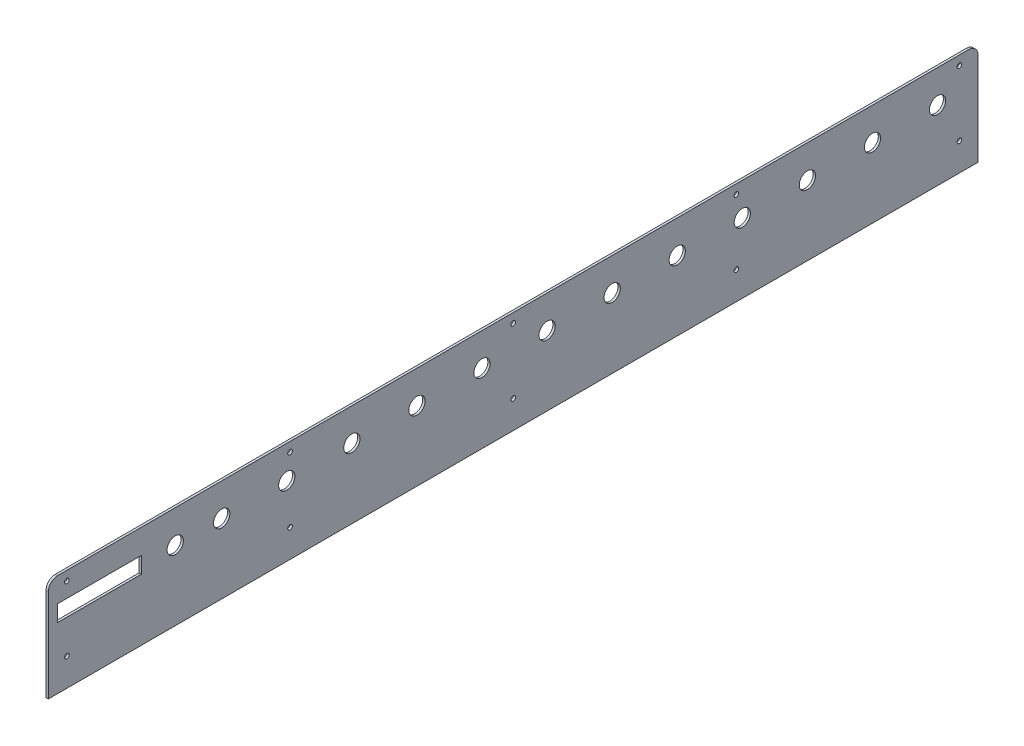
ISO-10303-21;
HEADER;
FILE_DESCRIPTION(('STEP AP214'),'2;1');
FILE_NAME('part.step','',(''),(''),'','','');
FILE_SCHEMA(('AUTOMOTIVE_DESIGN { 1 0 10303 214 1 1 1 1 }'));
ENDSEC;
DATA;
#1=APPLICATION_CONTEXT('core data for automotive mechanical design processes');
#2=APPLICATION_PROTOCOL_DEFINITION('international standard','automotive_design',2000,#1);
#3=PRODUCT_CONTEXT('',#1,'mechanical');
#4=PRODUCT('Part','Part','',(#3));
#5=PRODUCT_RELATED_PRODUCT_CATEGORY('part','',(#4));
#6=PRODUCT_DEFINITION_FORMATION('','',#4);
#7=PRODUCT_DEFINITION_CONTEXT('part definition',#1,'design');
#8=PRODUCT_DEFINITION('design','',#6,#7);
#9=PRODUCT_DEFINITION_SHAPE('','',#8);
#10=(LENGTH_UNIT() NAMED_UNIT(*) SI_UNIT(.MILLI.,.METRE.));
#11=(NAMED_UNIT(*) PLANE_ANGLE_UNIT() SI_UNIT($,.RADIAN.));
#12=(NAMED_UNIT(*) SI_UNIT($,.STERADIAN.) SOLID_ANGLE_UNIT());
#13=UNCERTAINTY_MEASURE_WITH_UNIT(LENGTH_MEASURE(1.E-05),#10,'distance_accuracy_value','');
#14=(GEOMETRIC_REPRESENTATION_CONTEXT(3) GLOBAL_UNCERTAINTY_ASSIGNED_CONTEXT((#13)) GLOBAL_UNIT_ASSIGNED_CONTEXT((#10,
#11,#12)) REPRESENTATION_CONTEXT('',''));
#15=CARTESIAN_POINT('',(0.,0.,0.));
#16=DIRECTION('',(0.,0.,1.));
#17=DIRECTION('',(1.,0.,0.));
#18=AXIS2_PLACEMENT_3D('',#15,#16,#17);
#19=CARTESIAN_POINT('',(0.,0.,0.));
#20=DIRECTION('',(0.,-1.,0.));
#21=DIRECTION('',(0.,0.,-1.));
#22=AXIS2_PLACEMENT_3D('',#19,#20,#21);
#23=PLANE('',#22);
#24=DIRECTION('',(0.,0.,-1.));
#25=VECTOR('',#24,1.);
#26=CARTESIAN_POINT('',(2.5,0.,0.));
#27=LINE('',#26,#25);
#28=CARTESIAN_POINT('',(2.5,0.,0.));
#29=VERTEX_POINT('',#28);
#30=CARTESIAN_POINT('',(2.5,0.,-1000.));
#31=VERTEX_POINT('',#30);
#32=EDGE_CURVE('E232',#29,#31,#27,.T.);
#33=ORIENTED_EDGE('',*,*,#32,.F.);
#34=DIRECTION('',(1.,0.,0.));
#35=VECTOR('',#34,1.);
#36=CARTESIAN_POINT('',(0.,0.,0.));
#37=LINE('',#36,#35);
#38=CARTESIAN_POINT('',(0.,0.,0.));
#39=VERTEX_POINT('',#38);
#40=EDGE_CURVE('E11',#39,#29,#37,.T.);
#41=ORIENTED_EDGE('',*,*,#40,.F.);
#42=DIRECTION('',(0.,0.,-1.));
#43=VECTOR('',#42,1.);
#44=CARTESIAN_POINT('',(0.,0.,0.));
#45=LINE('',#44,#43);
#46=CARTESIAN_POINT('',(0.,0.,-1000.));
#47=VERTEX_POINT('',#46);
#48=EDGE_CURVE('E235',#39,#47,#45,.T.);
#49=ORIENTED_EDGE('',*,*,#48,.T.);
#50=DIRECTION('',(1.,0.,0.));
#51=VECTOR('',#50,1.);
#52=CARTESIAN_POINT('',(0.,0.,-1000.));
#53=LINE('',#52,#51);
#54=EDGE_CURVE('E42',#47,#31,#53,.T.);
#55=ORIENTED_EDGE('',*,*,#54,.T.);
#56=EDGE_LOOP('',(#33,#41,#49,#55));
#57=FACE_BOUND('',#56,.T.);
#58=ADVANCED_FACE('F39',(#57),#23,.T.);
#59=CARTESIAN_POINT('',(0.,100.,0.));
#60=DIRECTION('',(0.,0.,1.));
#61=DIRECTION('',(1.,0.,0.));
#62=AXIS2_PLACEMENT_3D('',#59,#60,#61);
#63=PLANE('',#62);
#64=DIRECTION('',(0.,-1.,0.));
#65=VECTOR('',#64,1.);
#66=CARTESIAN_POINT('',(2.5,100.,0.));
#67=LINE('',#66,#65);
#68=CARTESIAN_POINT('',(2.5,100.,0.));
#69=VERTEX_POINT('',#68);
#70=EDGE_CURVE('E239',#69,#29,#67,.T.);
#71=ORIENTED_EDGE('',*,*,#70,.F.);
#72=DIRECTION('',(1.,0.,0.));
#73=VECTOR('',#72,1.);
#74=CARTESIAN_POINT('',(0.,100.,0.));
#75=LINE('',#74,#73);
#76=CARTESIAN_POINT('',(0.,100.,0.));
#77=VERTEX_POINT('',#76);
#78=EDGE_CURVE('E47',#77,#69,#75,.T.);
#79=ORIENTED_EDGE('',*,*,#78,.F.);
#80=DIRECTION('',(0.,-1.,0.));
#81=VECTOR('',#80,1.);
#82=CARTESIAN_POINT('',(0.,100.,0.));
#83=LINE('',#82,#81);
#84=EDGE_CURVE('E251',#77,#39,#83,.T.);
#85=ORIENTED_EDGE('',*,*,#84,.T.);
#86=ORIENTED_EDGE('',*,*,#40,.T.);
#87=EDGE_LOOP('',(#71,#79,#85,#86));
#88=FACE_BOUND('',#87,.T.);
#89=ADVANCED_FACE('F288',(#88),#63,.T.);
#90=CARTESIAN_POINT('',(0.,100.,-10.));
#91=DIRECTION('',(1.,0.,0.));
#92=DIRECTION('',(0.,0.,-1.));
#93=AXIS2_PLACEMENT_3D('',#90,#91,#92);
#94=CYLINDRICAL_SURFACE('',#93,10.);
#95=CARTESIAN_POINT('',(2.5,100.,-10.));
#96=DIRECTION('',(1.,0.,0.));
#97=DIRECTION('',(0.,0.,-1.));
#98=AXIS2_PLACEMENT_3D('',#95,#96,#97);
#99=CIRCLE('',#98,10.);
#100=CARTESIAN_POINT('',(2.5,110.,-10.));
#101=VERTEX_POINT('',#100);
#102=EDGE_CURVE('E265',#101,#69,#99,.T.);
#103=ORIENTED_EDGE('',*,*,#102,.F.);
#104=DIRECTION('',(1.,0.,0.));
#105=VECTOR('',#104,1.);
#106=CARTESIAN_POINT('',(0.,110.,-10.));
#107=LINE('',#106,#105);
#108=CARTESIAN_POINT('',(0.,110.,-10.));
#109=VERTEX_POINT('',#108);
#110=EDGE_CURVE('E271',#109,#101,#107,.T.);
#111=ORIENTED_EDGE('',*,*,#110,.F.);
#112=CARTESIAN_POINT('',(0.,100.,-10.));
#113=DIRECTION('',(1.,0.,0.));
#114=DIRECTION('',(0.,0.,-1.));
#115=AXIS2_PLACEMENT_3D('',#112,#113,#114);
#116=CIRCLE('',#115,10.);
#117=EDGE_CURVE('E248',#109,#77,#116,.T.);
#118=ORIENTED_EDGE('',*,*,#117,.T.);
#119=ORIENTED_EDGE('',*,*,#78,.T.);
#120=EDGE_LOOP('',(#103,#111,#118,#119));
#121=FACE_BOUND('',#120,.T.);
#122=ADVANCED_FACE('F300',(#121),#94,.T.);
#123=CARTESIAN_POINT('',(0.,110.,-990.));
#124=DIRECTION('',(0.,1.,0.));
#125=DIRECTION('',(0.,0.,1.));
#126=AXIS2_PLACEMENT_3D('',#123,#124,#125);
#127=PLANE('',#126);
#128=DIRECTION('',(0.,0.,1.));
#129=VECTOR('',#128,1.);
#130=CARTESIAN_POINT('',(2.5,110.,-990.));
#131=LINE('',#130,#129);
#132=CARTESIAN_POINT('',(2.5,110.,-990.));
#133=VERTEX_POINT('',#132);
#134=EDGE_CURVE('E262',#133,#101,#131,.T.);
#135=ORIENTED_EDGE('',*,*,#134,.F.);
#136=DIRECTION('',(1.,0.,0.));
#137=VECTOR('',#136,1.);
#138=CARTESIAN_POINT('',(0.,110.,-990.));
#139=LINE('',#138,#137);
#140=CARTESIAN_POINT('',(0.,110.,-990.));
#141=VERTEX_POINT('',#140);
#142=EDGE_CURVE('E273',#141,#133,#139,.T.);
#143=ORIENTED_EDGE('',*,*,#142,.F.);
#144=DIRECTION('',(0.,0.,1.));
#145=VECTOR('',#144,1.);
#146=CARTESIAN_POINT('',(0.,110.,-990.));
#147=LINE('',#146,#145);
#148=EDGE_CURVE('E245',#141,#109,#147,.T.);
#149=ORIENTED_EDGE('',*,*,#148,.T.);
#150=ORIENTED_EDGE('',*,*,#110,.T.);
#151=EDGE_LOOP('',(#135,#143,#149,#150));
#152=FACE_BOUND('',#151,.T.);
#153=ADVANCED_FACE('F298',(#152),#127,.T.);
#154=CARTESIAN_POINT('',(0.,100.,-990.));
#155=DIRECTION('',(1.,0.,0.));
#156=DIRECTION('',(0.,0.,-1.));
#157=AXIS2_PLACEMENT_3D('',#154,#155,#156);
#158=CYLINDRICAL_SURFACE('',#157,10.);
#159=CARTESIAN_POINT('',(2.5,100.,-990.));
#160=DIRECTION('',(1.,0.,0.));
#161=DIRECTION('',(0.,0.,-1.));
#162=AXIS2_PLACEMENT_3D('',#159,#160,#161);
#163=CIRCLE('',#162,10.);
#164=CARTESIAN_POINT('',(2.5,100.,-1000.));
#165=VERTEX_POINT('',#164);
#166=EDGE_CURVE('E259',#165,#133,#163,.T.);
#167=ORIENTED_EDGE('',*,*,#166,.F.);
#168=DIRECTION('',(1.,0.,0.));
#169=VECTOR('',#168,1.);
#170=CARTESIAN_POINT('',(0.,100.,-1000.));
#171=LINE('',#170,#169);
#172=CARTESIAN_POINT('',(0.,100.,-1000.));
#173=VERTEX_POINT('',#172);
#174=EDGE_CURVE('E274',#173,#165,#171,.T.);
#175=ORIENTED_EDGE('',*,*,#174,.F.);
#176=CARTESIAN_POINT('',(0.,100.,-990.));
#177=DIRECTION('',(1.,0.,0.));
#178=DIRECTION('',(0.,0.,-1.));
#179=AXIS2_PLACEMENT_3D('',#176,#177,#178);
#180=CIRCLE('',#179,10.);
#181=EDGE_CURVE('E242',#173,#141,#180,.T.);
#182=ORIENTED_EDGE('',*,*,#181,.T.);
#183=ORIENTED_EDGE('',*,*,#142,.T.);
#184=EDGE_LOOP('',(#167,#175,#182,#183));
#185=FACE_BOUND('',#184,.T.);
#186=ADVANCED_FACE('F295',(#185),#158,.T.);
#187=CARTESIAN_POINT('',(0.,0.,-1000.));
#188=DIRECTION('',(0.,0.,-1.));
#189=DIRECTION('',(-1.,0.,0.));
#190=AXIS2_PLACEMENT_3D('',#187,#188,#189);
#191=PLANE('',#190);
#192=DIRECTION('',(0.,1.,0.));
#193=VECTOR('',#192,1.);
#194=CARTESIAN_POINT('',(2.5,0.,-1000.));
#195=LINE('',#194,#193);
#196=EDGE_CURVE('E256',#31,#165,#195,.T.);
#197=ORIENTED_EDGE('',*,*,#196,.F.);
#198=ORIENTED_EDGE('',*,*,#54,.F.);
#199=DIRECTION('',(0.,1.,0.));
#200=VECTOR('',#199,1.);
#201=CARTESIAN_POINT('',(0.,0.,-1000.));
#202=LINE('',#201,#200);
#203=EDGE_CURVE('E238',#47,#173,#202,.T.);
#204=ORIENTED_EDGE('',*,*,#203,.T.);
#205=ORIENTED_EDGE('',*,*,#174,.T.);
#206=EDGE_LOOP('',(#197,#198,#204,#205));
#207=FACE_BOUND('',#206,.T.);
#208=ADVANCED_FACE('F282',(#207),#191,.T.);
#209=CARTESIAN_POINT('',(0.,100.,-990.));
#210=DIRECTION('',(1.,0.,0.));
#211=DIRECTION('',(0.,0.,-1.));
#212=AXIS2_PLACEMENT_3D('',#209,#210,#211);
#213=PLANE('',#212);
#214=CARTESIAN_POINT('',(0.,100.,-740.));
#215=DIRECTION('',(1.,0.,0.));
#216=DIRECTION('',(0.,0.,-1.));
#217=AXIS2_PLACEMENT_3D('',#214,#215,#216);
#218=CIRCLE('',#217,2.49999999999991);
#219=CARTESIAN_POINT('',(0.,100.,-742.5));
#220=VERTEX_POINT('',#219);
#221=EDGE_CURVE('E631',#220,#220,#218,.T.);
#222=ORIENTED_EDGE('',*,*,#221,.T.);
#223=EDGE_LOOP('',(#222));
#224=FACE_BOUND('',#223,.T.);
#225=CARTESIAN_POINT('',(0.,100.,-260.));
#226=DIRECTION('',(1.,0.,0.));
#227=DIRECTION('',(0.,0.,-1.));
#228=AXIS2_PLACEMENT_3D('',#225,#226,#227);
#229=CIRCLE('',#228,2.50000000000002);
#230=CARTESIAN_POINT('',(0.,100.,-262.5));
#231=VERTEX_POINT('',#230);
#232=EDGE_CURVE('E734',#231,#231,#229,.T.);
#233=ORIENTED_EDGE('',*,*,#232,.T.);
#234=EDGE_LOOP('',(#233));
#235=FACE_BOUND('',#234,.T.);
#236=CARTESIAN_POINT('',(0.,30.,-260.));
#237=DIRECTION('',(1.,0.,0.));
#238=DIRECTION('',(0.,0.,-1.));
#239=AXIS2_PLACEMENT_3D('',#236,#237,#238);
#240=CIRCLE('',#239,2.50000000000002);
#241=CARTESIAN_POINT('',(0.,30.,-262.5));
#242=VERTEX_POINT('',#241);
#243=EDGE_CURVE('E725',#242,#242,#240,.T.);
#244=ORIENTED_EDGE('',*,*,#243,.T.);
#245=EDGE_LOOP('',(#244));
#246=FACE_BOUND('',#245,.T.);
#247=CARTESIAN_POINT('',(0.,30.,-20.));
#248=DIRECTION('',(1.,0.,0.));
#249=DIRECTION('',(0.,0.,-1.));
#250=AXIS2_PLACEMENT_3D('',#247,#248,#249);
#251=CIRCLE('',#250,2.5);
#252=CARTESIAN_POINT('',(0.,30.,-22.5));
#253=VERTEX_POINT('',#252);
#254=EDGE_CURVE('E667',#253,#253,#251,.T.);
#255=ORIENTED_EDGE('',*,*,#254,.T.);
#256=EDGE_LOOP('',(#255));
#257=FACE_BOUND('',#256,.T.);
#258=CARTESIAN_POINT('',(0.,30.,-500.));
#259=DIRECTION('',(1.,0.,0.));
#260=DIRECTION('',(0.,0.,-1.));
#261=AXIS2_PLACEMENT_3D('',#258,#259,#260);
#262=CIRCLE('',#261,2.49999999999991);
#263=CARTESIAN_POINT('',(0.,30.,-502.5));
#264=VERTEX_POINT('',#263);
#265=EDGE_CURVE('E662',#264,#264,#262,.T.);
#266=ORIENTED_EDGE('',*,*,#265,.T.);
#267=EDGE_LOOP('',(#266));
#268=FACE_BOUND('',#267,.T.);
#269=CARTESIAN_POINT('',(0.,30.,-980.));
#270=DIRECTION('',(1.,0.,0.));
#271=DIRECTION('',(0.,0.,-1.));
#272=AXIS2_PLACEMENT_3D('',#269,#270,#271);
#273=CIRCLE('',#272,2.49999999999991);
#274=CARTESIAN_POINT('',(0.,30.,-982.5));
#275=VERTEX_POINT('',#274);
#276=EDGE_CURVE('E656',#275,#275,#273,.T.);
#277=ORIENTED_EDGE('',*,*,#276,.T.);
#278=EDGE_LOOP('',(#277));
#279=FACE_BOUND('',#278,.T.);
#280=CARTESIAN_POINT('',(0.,100.,-980.));
#281=DIRECTION('',(1.,0.,0.));
#282=DIRECTION('',(0.,0.,-1.));
#283=AXIS2_PLACEMENT_3D('',#280,#281,#282);
#284=CIRCLE('',#283,2.49999999999991);
#285=CARTESIAN_POINT('',(0.,100.,-982.5));
#286=VERTEX_POINT('',#285);
#287=EDGE_CURVE('E650',#286,#286,#284,.T.);
#288=ORIENTED_EDGE('',*,*,#287,.T.);
#289=EDGE_LOOP('',(#288));
#290=FACE_BOUND('',#289,.T.);
#291=CARTESIAN_POINT('',(0.,100.,-20.));
#292=DIRECTION('',(1.,0.,0.));
#293=DIRECTION('',(0.,0.,-1.));
#294=AXIS2_PLACEMENT_3D('',#291,#292,#293);
#295=CIRCLE('',#294,2.5);
#296=CARTESIAN_POINT('',(0.,100.,-22.5));
#297=VERTEX_POINT('',#296);
#298=EDGE_CURVE('E644',#297,#297,#295,.T.);
#299=ORIENTED_EDGE('',*,*,#298,.T.);
#300=EDGE_LOOP('',(#299));
#301=FACE_BOUND('',#300,.T.);
#302=CARTESIAN_POINT('',(0.,30.,-740.));
#303=DIRECTION('',(1.,0.,0.));
#304=DIRECTION('',(0.,0.,-1.));
#305=AXIS2_PLACEMENT_3D('',#302,#303,#304);
#306=CIRCLE('',#305,2.49999999999991);
#307=CARTESIAN_POINT('',(0.,30.,-742.5));
#308=VERTEX_POINT('',#307);
#309=EDGE_CURVE('E635',#308,#308,#306,.T.);
#310=ORIENTED_EDGE('',*,*,#309,.T.);
#311=EDGE_LOOP('',(#310));
#312=FACE_BOUND('',#311,.T.);
#313=CARTESIAN_POINT('',(0.,100.,-500.));
#314=DIRECTION('',(1.,0.,0.));
#315=DIRECTION('',(0.,0.,-1.));
#316=AXIS2_PLACEMENT_3D('',#313,#314,#315);
#317=CIRCLE('',#316,2.49999999999991);
#318=CARTESIAN_POINT('',(0.,100.,-502.5));
#319=VERTEX_POINT('',#318);
#320=EDGE_CURVE('E147',#319,#319,#317,.T.);
#321=ORIENTED_EDGE('',*,*,#320,.T.);
#322=EDGE_LOOP('',(#321));
#323=FACE_BOUND('',#322,.T.);
#324=DIRECTION('',(0.,-1.,0.));
#325=VECTOR('',#324,1.);
#326=CARTESIAN_POINT('',(0.,66.25,-10.));
#327=LINE('',#326,#325);
#328=CARTESIAN_POINT('',(0.,83.75,-10.));
#329=VERTEX_POINT('',#328);
#330=CARTESIAN_POINT('',(0.,66.25,-10.));
#331=VERTEX_POINT('',#330);
#332=EDGE_CURVE('E124',#329,#331,#327,.T.);
#333=ORIENTED_EDGE('',*,*,#332,.T.);
#334=DIRECTION('',(0.,0.,-1.));
#335=VECTOR('',#334,1.);
#336=CARTESIAN_POINT('',(0.,66.25,-100.));
#337=LINE('',#336,#335);
#338=CARTESIAN_POINT('',(0.,66.25,-100.));
#339=VERTEX_POINT('',#338);
#340=EDGE_CURVE('E118',#331,#339,#337,.T.);
#341=ORIENTED_EDGE('',*,*,#340,.T.);
#342=DIRECTION('',(0.,1.,0.));
#343=VECTOR('',#342,1.);
#344=CARTESIAN_POINT('',(0.,83.75,-100.));
#345=LINE('',#344,#343);
#346=CARTESIAN_POINT('',(0.,83.75,-100.));
#347=VERTEX_POINT('',#346);
#348=EDGE_CURVE('E127',#339,#347,#345,.T.);
#349=ORIENTED_EDGE('',*,*,#348,.T.);
#350=DIRECTION('',(0.,0.,1.));
#351=VECTOR('',#350,1.);
#352=CARTESIAN_POINT('',(0.,83.75,-10.));
#353=LINE('',#352,#351);
#354=EDGE_CURVE('E55',#347,#329,#353,.T.);
#355=ORIENTED_EDGE('',*,*,#354,.T.);
#356=EDGE_LOOP('',(#333,#341,#349,#355));
#357=FACE_BOUND('',#356,.T.);
#358=CARTESIAN_POINT('',(0.,75.,-956.5));
#359=DIRECTION('',(1.,0.,0.));
#360=DIRECTION('',(0.,0.,1.));
#361=AXIS2_PLACEMENT_3D('',#358,#359,#360);
#362=CIRCLE('',#361,8.75000000000004);
#363=CARTESIAN_POINT('',(0.,75.,-947.75));
#364=VERTEX_POINT('',#363);
#365=EDGE_CURVE('E157',#364,#364,#362,.T.);
#366=ORIENTED_EDGE('',*,*,#365,.T.);
#367=EDGE_LOOP('',(#366));
#368=FACE_BOUND('',#367,.T.);
#369=CARTESIAN_POINT('',(0.,75.,-886.5));
#370=DIRECTION('',(1.,0.,0.));
#371=DIRECTION('',(0.,0.,1.));
#372=AXIS2_PLACEMENT_3D('',#369,#370,#371);
#373=CIRCLE('',#372,8.75000000000004);
#374=CARTESIAN_POINT('',(0.,75.,-877.75));
#375=VERTEX_POINT('',#374);
#376=EDGE_CURVE('E163',#375,#375,#373,.T.);
#377=ORIENTED_EDGE('',*,*,#376,.T.);
#378=EDGE_LOOP('',(#377));
#379=FACE_BOUND('',#378,.T.);
#380=CARTESIAN_POINT('',(0.,74.999999999999,-816.5));
#381=DIRECTION('',(1.,0.,0.));
#382=DIRECTION('',(0.,0.,1.));
#383=AXIS2_PLACEMENT_3D('',#380,#381,#382);
#384=CIRCLE('',#383,8.75000000000004);
#385=CARTESIAN_POINT('',(0.,74.999999999999,-807.75));
#386=VERTEX_POINT('',#385);
#387=EDGE_CURVE('E169',#386,#386,#384,.T.);
#388=ORIENTED_EDGE('',*,*,#387,.T.);
#389=EDGE_LOOP('',(#388));
#390=FACE_BOUND('',#389,.T.);
#391=CARTESIAN_POINT('',(0.,74.9999999999985,-746.5));
#392=DIRECTION('',(1.,0.,0.));
#393=DIRECTION('',(0.,0.,1.));
#394=AXIS2_PLACEMENT_3D('',#391,#392,#393);
#395=CIRCLE('',#394,8.75000000000004);
#396=CARTESIAN_POINT('',(0.,74.9999999999985,-737.75));
#397=VERTEX_POINT('',#396);
#398=EDGE_CURVE('E175',#397,#397,#395,.T.);
#399=ORIENTED_EDGE('',*,*,#398,.T.);
#400=EDGE_LOOP('',(#399));
#401=FACE_BOUND('',#400,.T.);
#402=CARTESIAN_POINT('',(0.,74.999999999998,-676.5));
#403=DIRECTION('',(1.,0.,0.));
#404=DIRECTION('',(0.,0.,1.));
#405=AXIS2_PLACEMENT_3D('',#402,#403,#404);
#406=CIRCLE('',#405,8.75000000000004);
#407=CARTESIAN_POINT('',(0.,74.999999999998,-667.75));
#408=VERTEX_POINT('',#407);
#409=EDGE_CURVE('E181',#408,#408,#406,.T.);
#410=ORIENTED_EDGE('',*,*,#409,.T.);
#411=EDGE_LOOP('',(#410));
#412=FACE_BOUND('',#411,.T.);
#413=CARTESIAN_POINT('',(0.,74.9999999999975,-606.5));
#414=DIRECTION('',(1.,0.,0.));
#415=DIRECTION('',(0.,0.,1.));
#416=AXIS2_PLACEMENT_3D('',#413,#414,#415);
#417=CIRCLE('',#416,8.75000000000004);
#418=CARTESIAN_POINT('',(0.,74.9999999999975,-597.75));
#419=VERTEX_POINT('',#418);
#420=EDGE_CURVE('E187',#419,#419,#417,.T.);
#421=ORIENTED_EDGE('',*,*,#420,.T.);
#422=EDGE_LOOP('',(#421));
#423=FACE_BOUND('',#422,.T.);
#424=CARTESIAN_POINT('',(0.,74.9999999999971,-536.5));
#425=DIRECTION('',(1.,0.,0.));
#426=DIRECTION('',(0.,0.,1.));
#427=AXIS2_PLACEMENT_3D('',#424,#425,#426);
#428=CIRCLE('',#427,8.75000000000004);
#429=CARTESIAN_POINT('',(0.,74.9999999999971,-527.75));
#430=VERTEX_POINT('',#429);
#431=EDGE_CURVE('E193',#430,#430,#428,.T.);
#432=ORIENTED_EDGE('',*,*,#431,.T.);
#433=EDGE_LOOP('',(#432));
#434=FACE_BOUND('',#433,.T.);
#435=CARTESIAN_POINT('',(0.,74.9999999999966,-466.5));
#436=DIRECTION('',(1.,0.,0.));
#437=DIRECTION('',(0.,0.,1.));
#438=AXIS2_PLACEMENT_3D('',#435,#436,#437);
#439=CIRCLE('',#438,8.74999999999998);
#440=CARTESIAN_POINT('',(0.,74.9999999999966,-457.75));
#441=VERTEX_POINT('',#440);
#442=EDGE_CURVE('E199',#441,#441,#439,.T.);
#443=ORIENTED_EDGE('',*,*,#442,.T.);
#444=EDGE_LOOP('',(#443));
#445=FACE_BOUND('',#444,.T.);
#446=CARTESIAN_POINT('',(0.,74.9999999999961,-396.5));
#447=DIRECTION('',(1.,0.,0.));
#448=DIRECTION('',(0.,0.,1.));
#449=AXIS2_PLACEMENT_3D('',#446,#447,#448);
#450=CIRCLE('',#449,8.74999999999998);
#451=CARTESIAN_POINT('',(0.,74.9999999999961,-387.75));
#452=VERTEX_POINT('',#451);
#453=EDGE_CURVE('E205',#452,#452,#450,.T.);
#454=ORIENTED_EDGE('',*,*,#453,.T.);
#455=EDGE_LOOP('',(#454));
#456=FACE_BOUND('',#455,.T.);
#457=CARTESIAN_POINT('',(0.,74.9999999999956,-326.5));
#458=DIRECTION('',(1.,0.,0.));
#459=DIRECTION('',(0.,0.,1.));
#460=AXIS2_PLACEMENT_3D('',#457,#458,#459);
#461=CIRCLE('',#460,8.74999999999998);
#462=CARTESIAN_POINT('',(0.,74.9999999999956,-317.75));
#463=VERTEX_POINT('',#462);
#464=EDGE_CURVE('E211',#463,#463,#461,.T.);
#465=ORIENTED_EDGE('',*,*,#464,.T.);
#466=EDGE_LOOP('',(#465));
#467=FACE_BOUND('',#466,.T.);
#468=CARTESIAN_POINT('',(0.,74.9999999999933,-256.5));
#469=DIRECTION('',(1.,0.,0.));
#470=DIRECTION('',(0.,0.,1.));
#471=AXIS2_PLACEMENT_3D('',#468,#469,#470);
#472=CIRCLE('',#471,8.74999999999998);
#473=CARTESIAN_POINT('',(0.,74.9999999999933,-247.75));
#474=VERTEX_POINT('',#473);
#475=EDGE_CURVE('E217',#474,#474,#472,.T.);
#476=ORIENTED_EDGE('',*,*,#475,.T.);
#477=EDGE_LOOP('',(#476));
#478=FACE_BOUND('',#477,.T.);
#479=CARTESIAN_POINT('',(0.,74.9999999999933,-186.5));
#480=DIRECTION('',(1.,0.,0.));
#481=DIRECTION('',(0.,0.,1.));
#482=AXIS2_PLACEMENT_3D('',#479,#480,#481);
#483=CIRCLE('',#482,8.75000000000001);
#484=CARTESIAN_POINT('',(0.,74.9999999999933,-177.75));
#485=VERTEX_POINT('',#484);
#486=EDGE_CURVE('E223',#485,#485,#483,.T.);
#487=ORIENTED_EDGE('',*,*,#486,.T.);
#488=EDGE_LOOP('',(#487));
#489=FACE_BOUND('',#488,.T.);
#490=CARTESIAN_POINT('',(0.,75.,-136.5));
#491=DIRECTION('',(1.,0.,0.));
#492=DIRECTION('',(0.,0.,1.));
#493=AXIS2_PLACEMENT_3D('',#490,#491,#492);
#494=CIRCLE('',#493,8.75000000000001);
#495=CARTESIAN_POINT('',(0.,75.,-127.75));
#496=VERTEX_POINT('',#495);
#497=EDGE_CURVE('E229',#496,#496,#494,.T.);
#498=ORIENTED_EDGE('',*,*,#497,.T.);
#499=EDGE_LOOP('',(#498));
#500=FACE_BOUND('',#499,.T.);
#501=ORIENTED_EDGE('',*,*,#48,.F.);
#502=ORIENTED_EDGE('',*,*,#84,.F.);
#503=ORIENTED_EDGE('',*,*,#117,.F.);
#504=ORIENTED_EDGE('',*,*,#148,.F.);
#505=ORIENTED_EDGE('',*,*,#181,.F.);
#506=ORIENTED_EDGE('',*,*,#203,.F.);
#507=EDGE_LOOP('',(#501,#502,#503,#504,#505,#506));
#508=FACE_BOUND('',#507,.T.);
#509=ADVANCED_FACE('F131',(#224,#235,#246,#257,#268,#279,#290,#301,#312,#323,#357,#368,#379,
#390,#401,#412,#423,#434,#445,#456,#467,#478,#489,#500,#508),#213,.F.);
#510=CARTESIAN_POINT('',(2.5,100.,-990.));
#511=DIRECTION('',(1.,0.,0.));
#512=DIRECTION('',(0.,0.,-1.));
#513=AXIS2_PLACEMENT_3D('',#510,#511,#512);
#514=PLANE('',#513);
#515=CARTESIAN_POINT('',(2.5,100.,-740.));
#516=DIRECTION('',(1.,0.,0.));
#517=DIRECTION('',(0.,0.,-1.));
#518=AXIS2_PLACEMENT_3D('',#515,#516,#517);
#519=CIRCLE('',#518,2.49999999999991);
#520=CARTESIAN_POINT('',(2.5,100.,-742.5));
#521=VERTEX_POINT('',#520);
#522=EDGE_CURVE('E634',#521,#521,#519,.T.);
#523=ORIENTED_EDGE('',*,*,#522,.F.);
#524=EDGE_LOOP('',(#523));
#525=FACE_BOUND('',#524,.T.);
#526=CARTESIAN_POINT('',(2.5,100.,-260.));
#527=DIRECTION('',(1.,0.,0.));
#528=DIRECTION('',(0.,0.,-1.));
#529=AXIS2_PLACEMENT_3D('',#526,#527,#528);
#530=CIRCLE('',#529,2.50000000000002);
#531=CARTESIAN_POINT('',(2.5,100.,-262.5));
#532=VERTEX_POINT('',#531);
#533=EDGE_CURVE('E637',#532,#532,#530,.T.);
#534=ORIENTED_EDGE('',*,*,#533,.F.);
#535=EDGE_LOOP('',(#534));
#536=FACE_BOUND('',#535,.T.);
#537=CARTESIAN_POINT('',(2.5,30.,-260.));
#538=DIRECTION('',(1.,0.,0.));
#539=DIRECTION('',(0.,0.,-1.));
#540=AXIS2_PLACEMENT_3D('',#537,#538,#539);
#541=CIRCLE('',#540,2.50000000000002);
#542=CARTESIAN_POINT('',(2.5,30.,-262.5));
#543=VERTEX_POINT('',#542);
#544=EDGE_CURVE('E731',#543,#543,#541,.T.);
#545=ORIENTED_EDGE('',*,*,#544,.F.);
#546=EDGE_LOOP('',(#545));
#547=FACE_BOUND('',#546,.T.);
#548=CARTESIAN_POINT('',(2.5,30.,-20.));
#549=DIRECTION('',(1.,0.,0.));
#550=DIRECTION('',(0.,0.,-1.));
#551=AXIS2_PLACEMENT_3D('',#548,#549,#550);
#552=CIRCLE('',#551,2.5);
#553=CARTESIAN_POINT('',(2.5,30.,-22.5));
#554=VERTEX_POINT('',#553);
#555=EDGE_CURVE('E720',#554,#554,#552,.T.);
#556=ORIENTED_EDGE('',*,*,#555,.F.);
#557=EDGE_LOOP('',(#556));
#558=FACE_BOUND('',#557,.T.);
#559=CARTESIAN_POINT('',(2.5,30.,-500.));
#560=DIRECTION('',(1.,0.,0.));
#561=DIRECTION('',(0.,0.,-1.));
#562=AXIS2_PLACEMENT_3D('',#559,#560,#561);
#563=CIRCLE('',#562,2.49999999999991);
#564=CARTESIAN_POINT('',(2.5,30.,-502.5));
#565=VERTEX_POINT('',#564);
#566=EDGE_CURVE('E665',#565,#565,#563,.T.);
#567=ORIENTED_EDGE('',*,*,#566,.F.);
#568=EDGE_LOOP('',(#567));
#569=FACE_BOUND('',#568,.T.);
#570=CARTESIAN_POINT('',(2.5,30.,-980.));
#571=DIRECTION('',(1.,0.,0.));
#572=DIRECTION('',(0.,0.,-1.));
#573=AXIS2_PLACEMENT_3D('',#570,#571,#572);
#574=CIRCLE('',#573,2.49999999999991);
#575=CARTESIAN_POINT('',(2.5,30.,-982.5));
#576=VERTEX_POINT('',#575);
#577=EDGE_CURVE('E659',#576,#576,#574,.T.);
#578=ORIENTED_EDGE('',*,*,#577,.F.);
#579=EDGE_LOOP('',(#578));
#580=FACE_BOUND('',#579,.T.);
#581=CARTESIAN_POINT('',(2.5,100.,-980.));
#582=DIRECTION('',(1.,0.,0.));
#583=DIRECTION('',(0.,0.,-1.));
#584=AXIS2_PLACEMENT_3D('',#581,#582,#583);
#585=CIRCLE('',#584,2.49999999999991);
#586=CARTESIAN_POINT('',(2.5,100.,-982.5));
#587=VERTEX_POINT('',#586);
#588=EDGE_CURVE('E653',#587,#587,#585,.T.);
#589=ORIENTED_EDGE('',*,*,#588,.F.);
#590=EDGE_LOOP('',(#589));
#591=FACE_BOUND('',#590,.T.);
#592=CARTESIAN_POINT('',(2.5,100.,-20.));
#593=DIRECTION('',(1.,0.,0.));
#594=DIRECTION('',(0.,0.,-1.));
#595=AXIS2_PLACEMENT_3D('',#592,#593,#594);
#596=CIRCLE('',#595,2.5);
#597=CARTESIAN_POINT('',(2.5,100.,-22.5));
#598=VERTEX_POINT('',#597);
#599=EDGE_CURVE('E647',#598,#598,#596,.T.);
#600=ORIENTED_EDGE('',*,*,#599,.F.);
#601=EDGE_LOOP('',(#600));
#602=FACE_BOUND('',#601,.T.);
#603=CARTESIAN_POINT('',(2.5,30.,-740.));
#604=DIRECTION('',(1.,0.,0.));
#605=DIRECTION('',(0.,0.,-1.));
#606=AXIS2_PLACEMENT_3D('',#603,#604,#605);
#607=CIRCLE('',#606,2.49999999999991);
#608=CARTESIAN_POINT('',(2.5,30.,-742.5));
#609=VERTEX_POINT('',#608);
#610=EDGE_CURVE('E640',#609,#609,#607,.T.);
#611=ORIENTED_EDGE('',*,*,#610,.F.);
#612=EDGE_LOOP('',(#611));
#613=FACE_BOUND('',#612,.T.);
#614=CARTESIAN_POINT('',(2.5,100.,-500.));
#615=DIRECTION('',(1.,0.,0.));
#616=DIRECTION('',(0.,0.,-1.));
#617=AXIS2_PLACEMENT_3D('',#614,#615,#616);
#618=CIRCLE('',#617,2.49999999999991);
#619=CARTESIAN_POINT('',(2.5,100.,-502.5));
#620=VERTEX_POINT('',#619);
#621=EDGE_CURVE('E140',#620,#620,#618,.T.);
#622=ORIENTED_EDGE('',*,*,#621,.F.);
#623=EDGE_LOOP('',(#622));
#624=FACE_BOUND('',#623,.T.);
#625=DIRECTION('',(0.,0.,-1.));
#626=VECTOR('',#625,1.);
#627=CARTESIAN_POINT('',(2.5,66.25,-100.));
#628=LINE('',#627,#626);
#629=CARTESIAN_POINT('',(2.5,66.25,-10.));
#630=VERTEX_POINT('',#629);
#631=CARTESIAN_POINT('',(2.5,66.25,-100.));
#632=VERTEX_POINT('',#631);
#633=EDGE_CURVE('E63',#630,#632,#628,.T.);
#634=ORIENTED_EDGE('',*,*,#633,.F.);
#635=DIRECTION('',(0.,-1.,0.));
#636=VECTOR('',#635,1.);
#637=CARTESIAN_POINT('',(2.5,66.25,-10.));
#638=LINE('',#637,#636);
#639=CARTESIAN_POINT('',(2.5,83.75,-10.));
#640=VERTEX_POINT('',#639);
#641=EDGE_CURVE('E134',#640,#630,#638,.T.);
#642=ORIENTED_EDGE('',*,*,#641,.F.);
#643=DIRECTION('',(0.,0.,1.));
#644=VECTOR('',#643,1.);
#645=CARTESIAN_POINT('',(2.5,83.75,-10.));
#646=LINE('',#645,#644);
#647=CARTESIAN_POINT('',(2.5,83.75,-100.));
#648=VERTEX_POINT('',#647);
#649=EDGE_CURVE('E137',#648,#640,#646,.T.);
#650=ORIENTED_EDGE('',*,*,#649,.F.);
#651=DIRECTION('',(0.,1.,0.));
#652=VECTOR('',#651,1.);
#653=CARTESIAN_POINT('',(2.5,83.75,-100.));
#654=LINE('',#653,#652);
#655=EDGE_CURVE('E146',#632,#648,#654,.T.);
#656=ORIENTED_EDGE('',*,*,#655,.F.);
#657=EDGE_LOOP('',(#634,#642,#650,#656));
#658=FACE_BOUND('',#657,.T.);
#659=CARTESIAN_POINT('',(2.5,75.,-956.5));
#660=DIRECTION('',(1.,0.,0.));
#661=DIRECTION('',(0.,0.,1.));
#662=AXIS2_PLACEMENT_3D('',#659,#660,#661);
#663=CIRCLE('',#662,8.75000000000004);
#664=CARTESIAN_POINT('',(2.5,75.,-947.75));
#665=VERTEX_POINT('',#664);
#666=EDGE_CURVE('E153',#665,#665,#663,.T.);
#667=ORIENTED_EDGE('',*,*,#666,.F.);
#668=EDGE_LOOP('',(#667));
#669=FACE_BOUND('',#668,.T.);
#670=CARTESIAN_POINT('',(2.5,75.,-886.5));
#671=DIRECTION('',(1.,0.,0.));
#672=DIRECTION('',(0.,0.,1.));
#673=AXIS2_PLACEMENT_3D('',#670,#671,#672);
#674=CIRCLE('',#673,8.75000000000004);
#675=CARTESIAN_POINT('',(2.5,75.,-877.75));
#676=VERTEX_POINT('',#675);
#677=EDGE_CURVE('E160',#676,#676,#674,.T.);
#678=ORIENTED_EDGE('',*,*,#677,.F.);
#679=EDGE_LOOP('',(#678));
#680=FACE_BOUND('',#679,.T.);
#681=CARTESIAN_POINT('',(2.5,74.999999999999,-816.5));
#682=DIRECTION('',(1.,0.,0.));
#683=DIRECTION('',(0.,0.,1.));
#684=AXIS2_PLACEMENT_3D('',#681,#682,#683);
#685=CIRCLE('',#684,8.75000000000004);
#686=CARTESIAN_POINT('',(2.5,74.999999999999,-807.75));
#687=VERTEX_POINT('',#686);
#688=EDGE_CURVE('E166',#687,#687,#685,.T.);
#689=ORIENTED_EDGE('',*,*,#688,.F.);
#690=EDGE_LOOP('',(#689));
#691=FACE_BOUND('',#690,.T.);
#692=CARTESIAN_POINT('',(2.5,74.9999999999985,-746.5));
#693=DIRECTION('',(1.,0.,0.));
#694=DIRECTION('',(0.,0.,1.));
#695=AXIS2_PLACEMENT_3D('',#692,#693,#694);
#696=CIRCLE('',#695,8.75000000000004);
#697=CARTESIAN_POINT('',(2.5,74.9999999999985,-737.75));
#698=VERTEX_POINT('',#697);
#699=EDGE_CURVE('E172',#698,#698,#696,.T.);
#700=ORIENTED_EDGE('',*,*,#699,.F.);
#701=EDGE_LOOP('',(#700));
#702=FACE_BOUND('',#701,.T.);
#703=CARTESIAN_POINT('',(2.5,74.999999999998,-676.5));
#704=DIRECTION('',(1.,0.,0.));
#705=DIRECTION('',(0.,0.,1.));
#706=AXIS2_PLACEMENT_3D('',#703,#704,#705);
#707=CIRCLE('',#706,8.75000000000004);
#708=CARTESIAN_POINT('',(2.5,74.999999999998,-667.75));
#709=VERTEX_POINT('',#708);
#710=EDGE_CURVE('E178',#709,#709,#707,.T.);
#711=ORIENTED_EDGE('',*,*,#710,.F.);
#712=EDGE_LOOP('',(#711));
#713=FACE_BOUND('',#712,.T.);
#714=CARTESIAN_POINT('',(2.5,74.9999999999975,-606.5));
#715=DIRECTION('',(1.,0.,0.));
#716=DIRECTION('',(0.,0.,1.));
#717=AXIS2_PLACEMENT_3D('',#714,#715,#716);
#718=CIRCLE('',#717,8.75000000000004);
#719=CARTESIAN_POINT('',(2.5,74.9999999999975,-597.75));
#720=VERTEX_POINT('',#719);
#721=EDGE_CURVE('E184',#720,#720,#718,.T.);
#722=ORIENTED_EDGE('',*,*,#721,.F.);
#723=EDGE_LOOP('',(#722));
#724=FACE_BOUND('',#723,.T.);
#725=CARTESIAN_POINT('',(2.5,74.9999999999971,-536.5));
#726=DIRECTION('',(1.,0.,0.));
#727=DIRECTION('',(0.,0.,1.));
#728=AXIS2_PLACEMENT_3D('',#725,#726,#727);
#729=CIRCLE('',#728,8.75000000000004);
#730=CARTESIAN_POINT('',(2.5,74.9999999999971,-527.75));
#731=VERTEX_POINT('',#730);
#732=EDGE_CURVE('E190',#731,#731,#729,.T.);
#733=ORIENTED_EDGE('',*,*,#732,.F.);
#734=EDGE_LOOP('',(#733));
#735=FACE_BOUND('',#734,.T.);
#736=CARTESIAN_POINT('',(2.5,74.9999999999966,-466.5));
#737=DIRECTION('',(1.,0.,0.));
#738=DIRECTION('',(0.,0.,1.));
#739=AXIS2_PLACEMENT_3D('',#736,#737,#738);
#740=CIRCLE('',#739,8.74999999999998);
#741=CARTESIAN_POINT('',(2.5,74.9999999999966,-457.75));
#742=VERTEX_POINT('',#741);
#743=EDGE_CURVE('E196',#742,#742,#740,.T.);
#744=ORIENTED_EDGE('',*,*,#743,.F.);
#745=EDGE_LOOP('',(#744));
#746=FACE_BOUND('',#745,.T.);
#747=CARTESIAN_POINT('',(2.5,74.9999999999961,-396.5));
#748=DIRECTION('',(1.,0.,0.));
#749=DIRECTION('',(0.,0.,1.));
#750=AXIS2_PLACEMENT_3D('',#747,#748,#749);
#751=CIRCLE('',#750,8.74999999999998);
#752=CARTESIAN_POINT('',(2.5,74.9999999999961,-387.75));
#753=VERTEX_POINT('',#752);
#754=EDGE_CURVE('E202',#753,#753,#751,.T.);
#755=ORIENTED_EDGE('',*,*,#754,.F.);
#756=EDGE_LOOP('',(#755));
#757=FACE_BOUND('',#756,.T.);
#758=CARTESIAN_POINT('',(2.5,74.9999999999956,-326.5));
#759=DIRECTION('',(1.,0.,0.));
#760=DIRECTION('',(0.,0.,1.));
#761=AXIS2_PLACEMENT_3D('',#758,#759,#760);
#762=CIRCLE('',#761,8.74999999999998);
#763=CARTESIAN_POINT('',(2.5,74.9999999999956,-317.75));
#764=VERTEX_POINT('',#763);
#765=EDGE_CURVE('E208',#764,#764,#762,.T.);
#766=ORIENTED_EDGE('',*,*,#765,.F.);
#767=EDGE_LOOP('',(#766));
#768=FACE_BOUND('',#767,.T.);
#769=CARTESIAN_POINT('',(2.5,74.9999999999933,-256.5));
#770=DIRECTION('',(1.,0.,0.));
#771=DIRECTION('',(0.,0.,1.));
#772=AXIS2_PLACEMENT_3D('',#769,#770,#771);
#773=CIRCLE('',#772,8.74999999999998);
#774=CARTESIAN_POINT('',(2.5,74.9999999999933,-247.75));
#775=VERTEX_POINT('',#774);
#776=EDGE_CURVE('E214',#775,#775,#773,.T.);
#777=ORIENTED_EDGE('',*,*,#776,.F.);
#778=EDGE_LOOP('',(#777));
#779=FACE_BOUND('',#778,.T.);
#780=CARTESIAN_POINT('',(2.5,74.9999999999933,-186.5));
#781=DIRECTION('',(1.,0.,0.));
#782=DIRECTION('',(0.,0.,1.));
#783=AXIS2_PLACEMENT_3D('',#780,#781,#782);
#784=CIRCLE('',#783,8.75000000000001);
#785=CARTESIAN_POINT('',(2.5,74.9999999999933,-177.75));
#786=VERTEX_POINT('',#785);
#787=EDGE_CURVE('E220',#786,#786,#784,.T.);
#788=ORIENTED_EDGE('',*,*,#787,.F.);
#789=EDGE_LOOP('',(#788));
#790=FACE_BOUND('',#789,.T.);
#791=CARTESIAN_POINT('',(2.5,75.,-136.5));
#792=DIRECTION('',(1.,0.,0.));
#793=DIRECTION('',(0.,0.,1.));
#794=AXIS2_PLACEMENT_3D('',#791,#792,#793);
#795=CIRCLE('',#794,8.75000000000001);
#796=CARTESIAN_POINT('',(2.5,75.,-127.75));
#797=VERTEX_POINT('',#796);
#798=EDGE_CURVE('E226',#797,#797,#795,.T.);
#799=ORIENTED_EDGE('',*,*,#798,.F.);
#800=EDGE_LOOP('',(#799));
#801=FACE_BOUND('',#800,.T.);
#802=ORIENTED_EDGE('',*,*,#32,.T.);
#803=ORIENTED_EDGE('',*,*,#196,.T.);
#804=ORIENTED_EDGE('',*,*,#166,.T.);
#805=ORIENTED_EDGE('',*,*,#134,.T.);
#806=ORIENTED_EDGE('',*,*,#102,.T.);
#807=ORIENTED_EDGE('',*,*,#70,.T.);
#808=EDGE_LOOP('',(#802,#803,#804,#805,#806,#807));
#809=FACE_BOUND('',#808,.T.);
#810=ADVANCED_FACE('F284',(#525,#536,#547,#558,#569,#580,#591,#602,#613,#624,#658,#669,#680,
#691,#702,#713,#724,#735,#746,#757,#768,#779,#790,#801,#809),#514,.T.);
#811=CARTESIAN_POINT('',(0.,75.,-136.5));
#812=DIRECTION('',(1.,0.,0.));
#813=DIRECTION('',(0.,0.,-1.));
#814=AXIS2_PLACEMENT_3D('',#811,#812,#813);
#815=CYLINDRICAL_SURFACE('',#814,8.75000000000001);
#816=ORIENTED_EDGE('',*,*,#497,.F.);
#817=EDGE_LOOP('',(#816));
#818=FACE_BOUND('',#817,.T.);
#819=ORIENTED_EDGE('',*,*,#798,.T.);
#820=EDGE_LOOP('',(#819));
#821=FACE_BOUND('',#820,.T.);
#822=ADVANCED_FACE('F348',(#818,#821),#815,.F.);
#823=CARTESIAN_POINT('',(0.,74.9999999999933,-186.5));
#824=DIRECTION('',(1.,0.,0.));
#825=DIRECTION('',(0.,0.,-1.));
#826=AXIS2_PLACEMENT_3D('',#823,#824,#825);
#827=CYLINDRICAL_SURFACE('',#826,8.75000000000001);
#828=ORIENTED_EDGE('',*,*,#486,.F.);
#829=EDGE_LOOP('',(#828));
#830=FACE_BOUND('',#829,.T.);
#831=ORIENTED_EDGE('',*,*,#787,.T.);
#832=EDGE_LOOP('',(#831));
#833=FACE_BOUND('',#832,.T.);
#834=ADVANCED_FACE('F353',(#830,#833),#827,.F.);
#835=CARTESIAN_POINT('',(0.,74.9999999999933,-256.5));
#836=DIRECTION('',(1.,0.,0.));
#837=DIRECTION('',(0.,0.,-1.));
#838=AXIS2_PLACEMENT_3D('',#835,#836,#837);
#839=CYLINDRICAL_SURFACE('',#838,8.74999999999998);
#840=ORIENTED_EDGE('',*,*,#475,.F.);
#841=EDGE_LOOP('',(#840));
#842=FACE_BOUND('',#841,.T.);
#843=ORIENTED_EDGE('',*,*,#776,.T.);
#844=EDGE_LOOP('',(#843));
#845=FACE_BOUND('',#844,.T.);
#846=ADVANCED_FACE('F365',(#842,#845),#839,.F.);
#847=CARTESIAN_POINT('',(0.,74.9999999999956,-326.5));
#848=DIRECTION('',(1.,0.,0.));
#849=DIRECTION('',(0.,0.,-1.));
#850=AXIS2_PLACEMENT_3D('',#847,#848,#849);
#851=CYLINDRICAL_SURFACE('',#850,8.74999999999998);
#852=ORIENTED_EDGE('',*,*,#464,.F.);
#853=EDGE_LOOP('',(#852));
#854=FACE_BOUND('',#853,.T.);
#855=ORIENTED_EDGE('',*,*,#765,.T.);
#856=EDGE_LOOP('',(#855));
#857=FACE_BOUND('',#856,.T.);
#858=ADVANCED_FACE('F375',(#854,#857),#851,.F.);
#859=CARTESIAN_POINT('',(0.,74.9999999999961,-396.5));
#860=DIRECTION('',(1.,0.,0.));
#861=DIRECTION('',(0.,0.,-1.));
#862=AXIS2_PLACEMENT_3D('',#859,#860,#861);
#863=CYLINDRICAL_SURFACE('',#862,8.74999999999998);
#864=ORIENTED_EDGE('',*,*,#453,.F.);
#865=EDGE_LOOP('',(#864));
#866=FACE_BOUND('',#865,.T.);
#867=ORIENTED_EDGE('',*,*,#754,.T.);
#868=EDGE_LOOP('',(#867));
#869=FACE_BOUND('',#868,.T.);
#870=ADVANCED_FACE('F385',(#866,#869),#863,.F.);
#871=CARTESIAN_POINT('',(0.,74.9999999999966,-466.5));
#872=DIRECTION('',(1.,0.,0.));
#873=DIRECTION('',(0.,0.,-1.));
#874=AXIS2_PLACEMENT_3D('',#871,#872,#873);
#875=CYLINDRICAL_SURFACE('',#874,8.74999999999998);
#876=ORIENTED_EDGE('',*,*,#442,.F.);
#877=EDGE_LOOP('',(#876));
#878=FACE_BOUND('',#877,.T.);
#879=ORIENTED_EDGE('',*,*,#743,.T.);
#880=EDGE_LOOP('',(#879));
#881=FACE_BOUND('',#880,.T.);
#882=ADVANCED_FACE('F395',(#878,#881),#875,.F.);
#883=CARTESIAN_POINT('',(0.,74.9999999999971,-536.5));
#884=DIRECTION('',(1.,0.,0.));
#885=DIRECTION('',(0.,0.,-1.));
#886=AXIS2_PLACEMENT_3D('',#883,#884,#885);
#887=CYLINDRICAL_SURFACE('',#886,8.75000000000004);
#888=ORIENTED_EDGE('',*,*,#431,.F.);
#889=EDGE_LOOP('',(#888));
#890=FACE_BOUND('',#889,.T.);
#891=ORIENTED_EDGE('',*,*,#732,.T.);
#892=EDGE_LOOP('',(#891));
#893=FACE_BOUND('',#892,.T.);
#894=ADVANCED_FACE('F405',(#890,#893),#887,.F.);
#895=CARTESIAN_POINT('',(0.,74.9999999999975,-606.5));
#896=DIRECTION('',(1.,0.,0.));
#897=DIRECTION('',(0.,0.,-1.));
#898=AXIS2_PLACEMENT_3D('',#895,#896,#897);
#899=CYLINDRICAL_SURFACE('',#898,8.75000000000004);
#900=ORIENTED_EDGE('',*,*,#420,.F.);
#901=EDGE_LOOP('',(#900));
#902=FACE_BOUND('',#901,.T.);
#903=ORIENTED_EDGE('',*,*,#721,.T.);
#904=EDGE_LOOP('',(#903));
#905=FACE_BOUND('',#904,.T.);
#906=ADVANCED_FACE('F415',(#902,#905),#899,.F.);
#907=CARTESIAN_POINT('',(0.,74.999999999998,-676.5));
#908=DIRECTION('',(1.,0.,0.));
#909=DIRECTION('',(0.,0.,-1.));
#910=AXIS2_PLACEMENT_3D('',#907,#908,#909);
#911=CYLINDRICAL_SURFACE('',#910,8.75000000000004);
#912=ORIENTED_EDGE('',*,*,#409,.F.);
#913=EDGE_LOOP('',(#912));
#914=FACE_BOUND('',#913,.T.);
#915=ORIENTED_EDGE('',*,*,#710,.T.);
#916=EDGE_LOOP('',(#915));
#917=FACE_BOUND('',#916,.T.);
#918=ADVANCED_FACE('F425',(#914,#917),#911,.F.);
#919=CARTESIAN_POINT('',(0.,74.9999999999985,-746.5));
#920=DIRECTION('',(1.,0.,0.));
#921=DIRECTION('',(0.,0.,-1.));
#922=AXIS2_PLACEMENT_3D('',#919,#920,#921);
#923=CYLINDRICAL_SURFACE('',#922,8.75000000000004);
#924=ORIENTED_EDGE('',*,*,#398,.F.);
#925=EDGE_LOOP('',(#924));
#926=FACE_BOUND('',#925,.T.);
#927=ORIENTED_EDGE('',*,*,#699,.T.);
#928=EDGE_LOOP('',(#927));
#929=FACE_BOUND('',#928,.T.);
#930=ADVANCED_FACE('F435',(#926,#929),#923,.F.);
#931=CARTESIAN_POINT('',(0.,74.999999999999,-816.5));
#932=DIRECTION('',(1.,0.,0.));
#933=DIRECTION('',(0.,0.,-1.));
#934=AXIS2_PLACEMENT_3D('',#931,#932,#933);
#935=CYLINDRICAL_SURFACE('',#934,8.75000000000004);
#936=ORIENTED_EDGE('',*,*,#387,.F.);
#937=EDGE_LOOP('',(#936));
#938=FACE_BOUND('',#937,.T.);
#939=ORIENTED_EDGE('',*,*,#688,.T.);
#940=EDGE_LOOP('',(#939));
#941=FACE_BOUND('',#940,.T.);
#942=ADVANCED_FACE('F445',(#938,#941),#935,.F.);
#943=CARTESIAN_POINT('',(0.,75.,-886.5));
#944=DIRECTION('',(1.,0.,0.));
#945=DIRECTION('',(0.,0.,-1.));
#946=AXIS2_PLACEMENT_3D('',#943,#944,#945);
#947=CYLINDRICAL_SURFACE('',#946,8.75000000000004);
#948=ORIENTED_EDGE('',*,*,#376,.F.);
#949=EDGE_LOOP('',(#948));
#950=FACE_BOUND('',#949,.T.);
#951=ORIENTED_EDGE('',*,*,#677,.T.);
#952=EDGE_LOOP('',(#951));
#953=FACE_BOUND('',#952,.T.);
#954=ADVANCED_FACE('F455',(#950,#953),#947,.F.);
#955=CARTESIAN_POINT('',(0.,75.,-956.5));
#956=DIRECTION('',(1.,0.,0.));
#957=DIRECTION('',(0.,0.,-1.));
#958=AXIS2_PLACEMENT_3D('',#955,#956,#957);
#959=CYLINDRICAL_SURFACE('',#958,8.75000000000004);
#960=ORIENTED_EDGE('',*,*,#365,.F.);
#961=EDGE_LOOP('',(#960));
#962=FACE_BOUND('',#961,.T.);
#963=ORIENTED_EDGE('',*,*,#666,.T.);
#964=EDGE_LOOP('',(#963));
#965=FACE_BOUND('',#964,.T.);
#966=ADVANCED_FACE('F465',(#962,#965),#959,.F.);
#967=CARTESIAN_POINT('',(0.,66.25,-100.));
#968=DIRECTION('',(0.,-1.,0.));
#969=DIRECTION('',(0.,0.,-1.));
#970=AXIS2_PLACEMENT_3D('',#967,#968,#969);
#971=PLANE('',#970);
#972=ORIENTED_EDGE('',*,*,#633,.T.);
#973=DIRECTION('',(1.,0.,0.));
#974=VECTOR('',#973,1.);
#975=CARTESIAN_POINT('',(0.,66.25,-100.));
#976=LINE('',#975,#974);
#977=EDGE_CURVE('E114',#339,#632,#976,.T.);
#978=ORIENTED_EDGE('',*,*,#977,.F.);
#979=ORIENTED_EDGE('',*,*,#340,.F.);
#980=DIRECTION('',(1.,0.,0.));
#981=VECTOR('',#980,1.);
#982=CARTESIAN_POINT('',(0.,66.25,-10.));
#983=LINE('',#982,#981);
#984=EDGE_CURVE('E151',#331,#630,#983,.T.);
#985=ORIENTED_EDGE('',*,*,#984,.T.);
#986=EDGE_LOOP('',(#972,#978,#979,#985));
#987=FACE_BOUND('',#986,.T.);
#988=ADVANCED_FACE('F116',(#987),#971,.F.);
#989=CARTESIAN_POINT('',(0.,66.25,-10.));
#990=DIRECTION('',(0.,0.,1.));
#991=DIRECTION('',(1.,0.,0.));
#992=AXIS2_PLACEMENT_3D('',#989,#990,#991);
#993=PLANE('',#992);
#994=ORIENTED_EDGE('',*,*,#641,.T.);
#995=ORIENTED_EDGE('',*,*,#984,.F.);
#996=ORIENTED_EDGE('',*,*,#332,.F.);
#997=DIRECTION('',(1.,0.,0.));
#998=VECTOR('',#997,1.);
#999=CARTESIAN_POINT('',(0.,83.75,-10.));
#1000=LINE('',#999,#998);
#1001=EDGE_CURVE('E154',#329,#640,#1000,.T.);
#1002=ORIENTED_EDGE('',*,*,#1001,.T.);
#1003=EDGE_LOOP('',(#994,#995,#996,#1002));
#1004=FACE_BOUND('',#1003,.T.);
#1005=ADVANCED_FACE('F484',(#1004),#993,.F.);
#1006=CARTESIAN_POINT('',(0.,83.75,-10.));
#1007=DIRECTION('',(0.,1.,0.));
#1008=DIRECTION('',(0.,0.,1.));
#1009=AXIS2_PLACEMENT_3D('',#1006,#1007,#1008);
#1010=PLANE('',#1009);
#1011=ORIENTED_EDGE('',*,*,#649,.T.);
#1012=ORIENTED_EDGE('',*,*,#1001,.F.);
#1013=ORIENTED_EDGE('',*,*,#354,.F.);
#1014=DIRECTION('',(1.,0.,0.));
#1015=VECTOR('',#1014,1.);
#1016=CARTESIAN_POINT('',(0.,83.75,-100.));
#1017=LINE('',#1016,#1015);
#1018=EDGE_CURVE('E123',#347,#648,#1017,.T.);
#1019=ORIENTED_EDGE('',*,*,#1018,.T.);
#1020=EDGE_LOOP('',(#1011,#1012,#1013,#1019));
#1021=FACE_BOUND('',#1020,.T.);
#1022=ADVANCED_FACE('F493',(#1021),#1010,.F.);
#1023=CARTESIAN_POINT('',(0.,83.75,-100.));
#1024=DIRECTION('',(0.,0.,-1.));
#1025=DIRECTION('',(-1.,0.,0.));
#1026=AXIS2_PLACEMENT_3D('',#1023,#1024,#1025);
#1027=PLANE('',#1026);
#1028=ORIENTED_EDGE('',*,*,#655,.T.);
#1029=ORIENTED_EDGE('',*,*,#1018,.F.);
#1030=ORIENTED_EDGE('',*,*,#348,.F.);
#1031=ORIENTED_EDGE('',*,*,#977,.T.);
#1032=EDGE_LOOP('',(#1028,#1029,#1030,#1031));
#1033=FACE_BOUND('',#1032,.T.);
#1034=ADVANCED_FACE('F128',(#1033),#1027,.F.);
#1035=CARTESIAN_POINT('',(0.,100.,-500.));
#1036=DIRECTION('',(1.,0.,0.));
#1037=DIRECTION('',(0.,0.,-1.));
#1038=AXIS2_PLACEMENT_3D('',#1035,#1036,#1037);
#1039=CYLINDRICAL_SURFACE('',#1038,2.49999999999991);
#1040=ORIENTED_EDGE('',*,*,#320,.F.);
#1041=EDGE_LOOP('',(#1040));
#1042=FACE_BOUND('',#1041,.T.);
#1043=ORIENTED_EDGE('',*,*,#621,.T.);
#1044=EDGE_LOOP('',(#1043));
#1045=FACE_BOUND('',#1044,.T.);
#1046=ADVANCED_FACE('F511',(#1042,#1045),#1039,.F.);
#1047=CARTESIAN_POINT('',(0.,30.,-740.));
#1048=DIRECTION('',(1.,0.,0.));
#1049=DIRECTION('',(0.,0.,-1.));
#1050=AXIS2_PLACEMENT_3D('',#1047,#1048,#1049);
#1051=CYLINDRICAL_SURFACE('',#1050,2.49999999999991);
#1052=ORIENTED_EDGE('',*,*,#309,.F.);
#1053=EDGE_LOOP('',(#1052));
#1054=FACE_BOUND('',#1053,.T.);
#1055=ORIENTED_EDGE('',*,*,#610,.T.);
#1056=EDGE_LOOP('',(#1055));
#1057=FACE_BOUND('',#1056,.T.);
#1058=ADVANCED_FACE('F534',(#1054,#1057),#1051,.F.);
#1059=CARTESIAN_POINT('',(0.,100.,-20.));
#1060=DIRECTION('',(1.,0.,0.));
#1061=DIRECTION('',(0.,0.,-1.));
#1062=AXIS2_PLACEMENT_3D('',#1059,#1060,#1061);
#1063=CYLINDRICAL_SURFACE('',#1062,2.5);
#1064=ORIENTED_EDGE('',*,*,#298,.F.);
#1065=EDGE_LOOP('',(#1064));
#1066=FACE_BOUND('',#1065,.T.);
#1067=ORIENTED_EDGE('',*,*,#599,.T.);
#1068=EDGE_LOOP('',(#1067));
#1069=FACE_BOUND('',#1068,.T.);
#1070=ADVANCED_FACE('F544',(#1066,#1069),#1063,.F.);
#1071=CARTESIAN_POINT('',(0.,100.,-980.));
#1072=DIRECTION('',(1.,0.,0.));
#1073=DIRECTION('',(0.,0.,-1.));
#1074=AXIS2_PLACEMENT_3D('',#1071,#1072,#1073);
#1075=CYLINDRICAL_SURFACE('',#1074,2.49999999999991);
#1076=ORIENTED_EDGE('',*,*,#287,.F.);
#1077=EDGE_LOOP('',(#1076));
#1078=FACE_BOUND('',#1077,.T.);
#1079=ORIENTED_EDGE('',*,*,#588,.T.);
#1080=EDGE_LOOP('',(#1079));
#1081=FACE_BOUND('',#1080,.T.);
#1082=ADVANCED_FACE('F554',(#1078,#1081),#1075,.F.);
#1083=CARTESIAN_POINT('',(0.,30.,-980.));
#1084=DIRECTION('',(1.,0.,0.));
#1085=DIRECTION('',(0.,0.,-1.));
#1086=AXIS2_PLACEMENT_3D('',#1083,#1084,#1085);
#1087=CYLINDRICAL_SURFACE('',#1086,2.49999999999991);
#1088=ORIENTED_EDGE('',*,*,#276,.F.);
#1089=EDGE_LOOP('',(#1088));
#1090=FACE_BOUND('',#1089,.T.);
#1091=ORIENTED_EDGE('',*,*,#577,.T.);
#1092=EDGE_LOOP('',(#1091));
#1093=FACE_BOUND('',#1092,.T.);
#1094=ADVANCED_FACE('F564',(#1090,#1093),#1087,.F.);
#1095=CARTESIAN_POINT('',(0.,30.,-500.));
#1096=DIRECTION('',(1.,0.,0.));
#1097=DIRECTION('',(0.,0.,-1.));
#1098=AXIS2_PLACEMENT_3D('',#1095,#1096,#1097);
#1099=CYLINDRICAL_SURFACE('',#1098,2.49999999999991);
#1100=ORIENTED_EDGE('',*,*,#265,.F.);
#1101=EDGE_LOOP('',(#1100));
#1102=FACE_BOUND('',#1101,.T.);
#1103=ORIENTED_EDGE('',*,*,#566,.T.);
#1104=EDGE_LOOP('',(#1103));
#1105=FACE_BOUND('',#1104,.T.);
#1106=ADVANCED_FACE('F574',(#1102,#1105),#1099,.F.);
#1107=CARTESIAN_POINT('',(0.,30.,-20.));
#1108=DIRECTION('',(1.,0.,0.));
#1109=DIRECTION('',(0.,0.,-1.));
#1110=AXIS2_PLACEMENT_3D('',#1107,#1108,#1109);
#1111=CYLINDRICAL_SURFACE('',#1110,2.5);
#1112=ORIENTED_EDGE('',*,*,#254,.F.);
#1113=EDGE_LOOP('',(#1112));
#1114=FACE_BOUND('',#1113,.T.);
#1115=ORIENTED_EDGE('',*,*,#555,.T.);
#1116=EDGE_LOOP('',(#1115));
#1117=FACE_BOUND('',#1116,.T.);
#1118=ADVANCED_FACE('F584',(#1114,#1117),#1111,.F.);
#1119=CARTESIAN_POINT('',(0.,30.,-260.));
#1120=DIRECTION('',(1.,0.,0.));
#1121=DIRECTION('',(0.,0.,-1.));
#1122=AXIS2_PLACEMENT_3D('',#1119,#1120,#1121);
#1123=CYLINDRICAL_SURFACE('',#1122,2.50000000000002);
#1124=ORIENTED_EDGE('',*,*,#243,.F.);
#1125=EDGE_LOOP('',(#1124));
#1126=FACE_BOUND('',#1125,.T.);
#1127=ORIENTED_EDGE('',*,*,#544,.T.);
#1128=EDGE_LOOP('',(#1127));
#1129=FACE_BOUND('',#1128,.T.);
#1130=ADVANCED_FACE('F594',(#1126,#1129),#1123,.F.);
#1131=CARTESIAN_POINT('',(0.,100.,-260.));
#1132=DIRECTION('',(1.,0.,0.));
#1133=DIRECTION('',(0.,0.,-1.));
#1134=AXIS2_PLACEMENT_3D('',#1131,#1132,#1133);
#1135=CYLINDRICAL_SURFACE('',#1134,2.50000000000002);
#1136=ORIENTED_EDGE('',*,*,#232,.F.);
#1137=EDGE_LOOP('',(#1136));
#1138=FACE_BOUND('',#1137,.T.);
#1139=ORIENTED_EDGE('',*,*,#533,.T.);
#1140=EDGE_LOOP('',(#1139));
#1141=FACE_BOUND('',#1140,.T.);
#1142=ADVANCED_FACE('F604',(#1138,#1141),#1135,.F.);
#1143=CARTESIAN_POINT('',(0.,100.,-740.));
#1144=DIRECTION('',(1.,0.,0.));
#1145=DIRECTION('',(0.,0.,-1.));
#1146=AXIS2_PLACEMENT_3D('',#1143,#1144,#1145);
#1147=CYLINDRICAL_SURFACE('',#1146,2.49999999999991);
#1148=ORIENTED_EDGE('',*,*,#221,.F.);
#1149=EDGE_LOOP('',(#1148));
#1150=FACE_BOUND('',#1149,.T.);
#1151=ORIENTED_EDGE('',*,*,#522,.T.);
#1152=EDGE_LOOP('',(#1151));
#1153=FACE_BOUND('',#1152,.T.);
#1154=ADVANCED_FACE('F614',(#1150,#1153),#1147,.F.);
#1155=CLOSED_SHELL('',(#58,#89,#122,#153,#186,#208,#509,#810,#822,#834,#846,#858,#870,#882,#894,
#906,#918,#930,#942,#954,#966,#988,#1005,#1022,#1034,#1046,#1058,#1070,#1082,#1094,#1106,#1118,
#1130,#1142,#1154));
#1156=MANIFOLD_SOLID_BREP('B2',#1155);
#1157=ADVANCED_BREP_SHAPE_REPRESENTATION('',(#18,#1156),#14);
#1158=SHAPE_DEFINITION_REPRESENTATION(#9,#1157);
ENDSEC;
END-ISO-10303-21;
